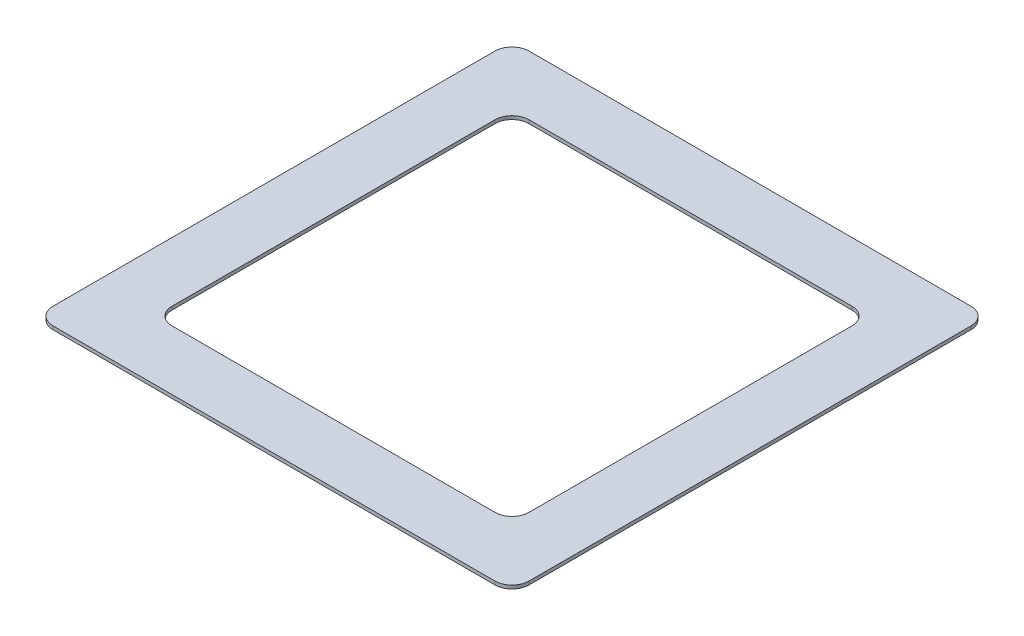
ISO-10303-21;
HEADER;
FILE_DESCRIPTION(('STEP AP214'),'2;1');
FILE_NAME('part.step','',(''),(''),'','','');
FILE_SCHEMA(('AUTOMOTIVE_DESIGN { 1 0 10303 214 1 1 1 1 }'));
ENDSEC;
DATA;
#1=APPLICATION_CONTEXT('core data for automotive mechanical design processes');
#2=APPLICATION_PROTOCOL_DEFINITION('international standard','automotive_design',2000,#1);
#3=PRODUCT_CONTEXT('',#1,'mechanical');
#4=PRODUCT('Part','Part','',(#3));
#5=PRODUCT_RELATED_PRODUCT_CATEGORY('part','',(#4));
#6=PRODUCT_DEFINITION_FORMATION('','',#4);
#7=PRODUCT_DEFINITION_CONTEXT('part definition',#1,'design');
#8=PRODUCT_DEFINITION('design','',#6,#7);
#9=PRODUCT_DEFINITION_SHAPE('','',#8);
#10=(LENGTH_UNIT() NAMED_UNIT(*) SI_UNIT(.MILLI.,.METRE.));
#11=(NAMED_UNIT(*) PLANE_ANGLE_UNIT() SI_UNIT($,.RADIAN.));
#12=(NAMED_UNIT(*) SI_UNIT($,.STERADIAN.) SOLID_ANGLE_UNIT());
#13=UNCERTAINTY_MEASURE_WITH_UNIT(LENGTH_MEASURE(1.E-05),#10,'distance_accuracy_value','');
#14=(GEOMETRIC_REPRESENTATION_CONTEXT(3) GLOBAL_UNCERTAINTY_ASSIGNED_CONTEXT((#13)) GLOBAL_UNIT_ASSIGNED_CONTEXT((#10,
#11,#12)) REPRESENTATION_CONTEXT('',''));
#15=CARTESIAN_POINT('',(0.,0.,0.));
#16=DIRECTION('',(0.,0.,1.));
#17=DIRECTION('',(1.,0.,0.));
#18=AXIS2_PLACEMENT_3D('',#15,#16,#17);
#19=CARTESIAN_POINT('',(10.,2.,270.));
#20=DIRECTION('',(0.,1.,0.));
#21=DIRECTION('',(0.,0.,1.));
#22=AXIS2_PLACEMENT_3D('',#19,#20,#21);
#23=PLANE('',#22);
#24=CARTESIAN_POINT('',(10.,2.,270.));
#25=DIRECTION('',(0.,1.,0.));
#26=DIRECTION('',(0.,0.,1.));
#27=AXIS2_PLACEMENT_3D('',#24,#25,#26);
#28=CIRCLE('',#27,10.);
#29=CARTESIAN_POINT('',(0.,2.,270.));
#30=VERTEX_POINT('',#29);
#31=CARTESIAN_POINT('',(10.0000000000001,2.,280.));
#32=VERTEX_POINT('',#31);
#33=EDGE_CURVE('E212',#30,#32,#28,.T.);
#34=ORIENTED_EDGE('',*,*,#33,.T.);
#35=DIRECTION('',(1.,0.,0.));
#36=VECTOR('',#35,1.);
#37=CARTESIAN_POINT('',(10.0000000000001,2.,280.));
#38=LINE('',#37,#36);
#39=CARTESIAN_POINT('',(270.,2.,280.));
#40=VERTEX_POINT('',#39);
#41=EDGE_CURVE('E215',#32,#40,#38,.T.);
#42=ORIENTED_EDGE('',*,*,#41,.T.);
#43=CARTESIAN_POINT('',(270.,2.,270.));
#44=DIRECTION('',(0.,1.,0.));
#45=DIRECTION('',(0.,0.,1.));
#46=AXIS2_PLACEMENT_3D('',#43,#44,#45);
#47=CIRCLE('',#46,10.);
#48=CARTESIAN_POINT('',(280.,2.,270.));
#49=VERTEX_POINT('',#48);
#50=EDGE_CURVE('E218',#40,#49,#47,.T.);
#51=ORIENTED_EDGE('',*,*,#50,.T.);
#52=DIRECTION('',(0.,0.,-1.));
#53=VECTOR('',#52,1.);
#54=CARTESIAN_POINT('',(280.,2.,10.0000000000001));
#55=LINE('',#54,#53);
#56=CARTESIAN_POINT('',(280.,2.,10.0000000000001));
#57=VERTEX_POINT('',#56);
#58=EDGE_CURVE('E220',#49,#57,#55,.T.);
#59=ORIENTED_EDGE('',*,*,#58,.T.);
#60=CARTESIAN_POINT('',(270.,2.,10.));
#61=DIRECTION('',(0.,1.,0.));
#62=DIRECTION('',(0.,0.,-1.));
#63=AXIS2_PLACEMENT_3D('',#60,#61,#62);
#64=CIRCLE('',#63,10.);
#65=CARTESIAN_POINT('',(270.,2.,0.));
#66=VERTEX_POINT('',#65);
#67=EDGE_CURVE('E222',#57,#66,#64,.T.);
#68=ORIENTED_EDGE('',*,*,#67,.T.);
#69=DIRECTION('',(-1.,0.,0.));
#70=VECTOR('',#69,1.);
#71=CARTESIAN_POINT('',(10.0000000000001,2.,0.));
#72=LINE('',#71,#70);
#73=CARTESIAN_POINT('',(10.0000000000001,2.,0.));
#74=VERTEX_POINT('',#73);
#75=EDGE_CURVE('E224',#66,#74,#72,.T.);
#76=ORIENTED_EDGE('',*,*,#75,.T.);
#77=CARTESIAN_POINT('',(10.,2.,10.));
#78=DIRECTION('',(0.,1.,0.));
#79=DIRECTION('',(0.,0.,1.));
#80=AXIS2_PLACEMENT_3D('',#77,#78,#79);
#81=CIRCLE('',#80,10.);
#82=CARTESIAN_POINT('',(0.,2.,10.0000000000001));
#83=VERTEX_POINT('',#82);
#84=EDGE_CURVE('E226',#74,#83,#81,.T.);
#85=ORIENTED_EDGE('',*,*,#84,.T.);
#86=DIRECTION('',(0.,0.,1.));
#87=VECTOR('',#86,1.);
#88=CARTESIAN_POINT('',(0.,2.,10.0000000000001));
#89=LINE('',#88,#87);
#90=EDGE_CURVE('E228',#83,#30,#89,.T.);
#91=ORIENTED_EDGE('',*,*,#90,.T.);
#92=EDGE_LOOP('',(#34,#42,#51,#59,#68,#76,#85,#91));
#93=FACE_BOUND('',#92,.T.);
#94=DIRECTION('',(1.,0.,0.));
#95=VECTOR('',#94,1.);
#96=CARTESIAN_POINT('',(45.0000000000001,2.,245.));
#97=LINE('',#96,#95);
#98=CARTESIAN_POINT('',(45.0000000000001,2.,245.));
#99=VERTEX_POINT('',#98);
#100=CARTESIAN_POINT('',(235.,2.,245.));
#101=VERTEX_POINT('',#100);
#102=EDGE_CURVE('E155',#99,#101,#97,.T.);
#103=ORIENTED_EDGE('',*,*,#102,.F.);
#104=CARTESIAN_POINT('',(45.,2.,235.));
#105=DIRECTION('',(0.,1.,0.));
#106=DIRECTION('',(0.,0.,1.));
#107=AXIS2_PLACEMENT_3D('',#104,#105,#106);
#108=CIRCLE('',#107,10.);
#109=CARTESIAN_POINT('',(35.,2.,235.));
#110=VERTEX_POINT('',#109);
#111=EDGE_CURVE('E147',#110,#99,#108,.T.);
#112=ORIENTED_EDGE('',*,*,#111,.F.);
#113=DIRECTION('',(0.,0.,1.));
#114=VECTOR('',#113,1.);
#115=CARTESIAN_POINT('',(35.,2.,45.0000000000001));
#116=LINE('',#115,#114);
#117=CARTESIAN_POINT('',(35.,2.,45.0000000000001));
#118=VERTEX_POINT('',#117);
#119=EDGE_CURVE('E180',#118,#110,#116,.T.);
#120=ORIENTED_EDGE('',*,*,#119,.F.);
#121=CARTESIAN_POINT('',(45.,2.,45.));
#122=DIRECTION('',(0.,1.,0.));
#123=DIRECTION('',(0.,0.,-1.));
#124=AXIS2_PLACEMENT_3D('',#121,#122,#123);
#125=CIRCLE('',#124,10.);
#126=CARTESIAN_POINT('',(45.,2.,35.));
#127=VERTEX_POINT('',#126);
#128=EDGE_CURVE('E178',#127,#118,#125,.T.);
#129=ORIENTED_EDGE('',*,*,#128,.F.);
#130=DIRECTION('',(-1.,0.,0.));
#131=VECTOR('',#130,1.);
#132=CARTESIAN_POINT('',(45.0000000000001,2.,35.));
#133=LINE('',#132,#131);
#134=CARTESIAN_POINT('',(235.,2.,35.));
#135=VERTEX_POINT('',#134);
#136=EDGE_CURVE('E176',#135,#127,#133,.T.);
#137=ORIENTED_EDGE('',*,*,#136,.F.);
#138=CARTESIAN_POINT('',(235.,2.,45.));
#139=DIRECTION('',(0.,1.,0.));
#140=DIRECTION('',(0.,0.,1.));
#141=AXIS2_PLACEMENT_3D('',#138,#139,#140);
#142=CIRCLE('',#141,10.);
#143=CARTESIAN_POINT('',(245.,2.,45.0000000000001));
#144=VERTEX_POINT('',#143);
#145=EDGE_CURVE('E174',#144,#135,#142,.T.);
#146=ORIENTED_EDGE('',*,*,#145,.F.);
#147=DIRECTION('',(0.,0.,-1.));
#148=VECTOR('',#147,1.);
#149=CARTESIAN_POINT('',(245.,2.,45.0000000000001));
#150=LINE('',#149,#148);
#151=CARTESIAN_POINT('',(245.,2.,235.));
#152=VERTEX_POINT('',#151);
#153=EDGE_CURVE('E170',#152,#144,#150,.T.);
#154=ORIENTED_EDGE('',*,*,#153,.F.);
#155=CARTESIAN_POINT('',(235.,2.,235.));
#156=DIRECTION('',(0.,1.,0.));
#157=DIRECTION('',(0.,0.,1.));
#158=AXIS2_PLACEMENT_3D('',#155,#156,#157);
#159=CIRCLE('',#158,10.);
#160=EDGE_CURVE('E168',#101,#152,#159,.T.);
#161=ORIENTED_EDGE('',*,*,#160,.F.);
#162=EDGE_LOOP('',(#103,#112,#120,#129,#137,#146,#154,#161));
#163=FACE_BOUND('',#162,.T.);
#164=ADVANCED_FACE('F34',(#93,#163),#23,.T.);
#165=CARTESIAN_POINT('',(10.,0.,270.));
#166=DIRECTION('',(0.,1.,0.));
#167=DIRECTION('',(0.,0.,1.));
#168=AXIS2_PLACEMENT_3D('',#165,#166,#167);
#169=PLANE('',#168);
#170=CARTESIAN_POINT('',(10.,0.,270.));
#171=DIRECTION('',(0.,1.,0.));
#172=DIRECTION('',(0.,0.,1.));
#173=AXIS2_PLACEMENT_3D('',#170,#171,#172);
#174=CIRCLE('',#173,10.);
#175=CARTESIAN_POINT('',(0.,0.,270.));
#176=VERTEX_POINT('',#175);
#177=CARTESIAN_POINT('',(10.0000000000001,0.,280.));
#178=VERTEX_POINT('',#177);
#179=EDGE_CURVE('E163',#176,#178,#174,.T.);
#180=ORIENTED_EDGE('',*,*,#179,.F.);
#181=DIRECTION('',(0.,0.,1.));
#182=VECTOR('',#181,1.);
#183=CARTESIAN_POINT('',(0.,0.,10.0000000000001));
#184=LINE('',#183,#182);
#185=CARTESIAN_POINT('',(0.,0.,10.0000000000001));
#186=VERTEX_POINT('',#185);
#187=EDGE_CURVE('E216',#186,#176,#184,.T.);
#188=ORIENTED_EDGE('',*,*,#187,.F.);
#189=CARTESIAN_POINT('',(10.,0.,10.));
#190=DIRECTION('',(0.,1.,0.));
#191=DIRECTION('',(0.,0.,1.));
#192=AXIS2_PLACEMENT_3D('',#189,#190,#191);
#193=CIRCLE('',#192,10.);
#194=CARTESIAN_POINT('',(10.0000000000001,0.,0.));
#195=VERTEX_POINT('',#194);
#196=EDGE_CURVE('E243',#195,#186,#193,.T.);
#197=ORIENTED_EDGE('',*,*,#196,.F.);
#198=DIRECTION('',(-1.,0.,0.));
#199=VECTOR('',#198,1.);
#200=CARTESIAN_POINT('',(10.0000000000001,0.,0.));
#201=LINE('',#200,#199);
#202=CARTESIAN_POINT('',(270.,0.,0.));
#203=VERTEX_POINT('',#202);
#204=EDGE_CURVE('E241',#203,#195,#201,.T.);
#205=ORIENTED_EDGE('',*,*,#204,.F.);
#206=CARTESIAN_POINT('',(270.,0.,10.));
#207=DIRECTION('',(0.,1.,0.));
#208=DIRECTION('',(0.,0.,-1.));
#209=AXIS2_PLACEMENT_3D('',#206,#207,#208);
#210=CIRCLE('',#209,10.);
#211=CARTESIAN_POINT('',(280.,0.,10.0000000000001));
#212=VERTEX_POINT('',#211);
#213=EDGE_CURVE('E239',#212,#203,#210,.T.);
#214=ORIENTED_EDGE('',*,*,#213,.F.);
#215=DIRECTION('',(0.,0.,-1.));
#216=VECTOR('',#215,1.);
#217=CARTESIAN_POINT('',(280.,0.,10.0000000000001));
#218=LINE('',#217,#216);
#219=CARTESIAN_POINT('',(280.,0.,270.));
#220=VERTEX_POINT('',#219);
#221=EDGE_CURVE('E237',#220,#212,#218,.T.);
#222=ORIENTED_EDGE('',*,*,#221,.F.);
#223=CARTESIAN_POINT('',(270.,0.,270.));
#224=DIRECTION('',(0.,1.,0.));
#225=DIRECTION('',(0.,0.,1.));
#226=AXIS2_PLACEMENT_3D('',#223,#224,#225);
#227=CIRCLE('',#226,10.);
#228=CARTESIAN_POINT('',(270.,0.,280.));
#229=VERTEX_POINT('',#228);
#230=EDGE_CURVE('E235',#229,#220,#227,.T.);
#231=ORIENTED_EDGE('',*,*,#230,.F.);
#232=DIRECTION('',(1.,0.,0.));
#233=VECTOR('',#232,1.);
#234=CARTESIAN_POINT('',(10.0000000000001,0.,280.));
#235=LINE('',#234,#233);
#236=EDGE_CURVE('E233',#178,#229,#235,.T.);
#237=ORIENTED_EDGE('',*,*,#236,.F.);
#238=EDGE_LOOP('',(#180,#188,#197,#205,#214,#222,#231,#237));
#239=FACE_BOUND('',#238,.T.);
#240=CARTESIAN_POINT('',(45.,0.,235.));
#241=DIRECTION('',(0.,1.,0.));
#242=DIRECTION('',(0.,0.,1.));
#243=AXIS2_PLACEMENT_3D('',#240,#241,#242);
#244=CIRCLE('',#243,10.);
#245=CARTESIAN_POINT('',(35.,0.,235.));
#246=VERTEX_POINT('',#245);
#247=CARTESIAN_POINT('',(45.0000000000001,0.,245.));
#248=VERTEX_POINT('',#247);
#249=EDGE_CURVE('E57',#246,#248,#244,.T.);
#250=ORIENTED_EDGE('',*,*,#249,.T.);
#251=DIRECTION('',(1.,0.,0.));
#252=VECTOR('',#251,1.);
#253=CARTESIAN_POINT('',(45.0000000000001,0.,245.));
#254=LINE('',#253,#252);
#255=CARTESIAN_POINT('',(235.,0.,245.));
#256=VERTEX_POINT('',#255);
#257=EDGE_CURVE('E162',#248,#256,#254,.T.);
#258=ORIENTED_EDGE('',*,*,#257,.T.);
#259=CARTESIAN_POINT('',(235.,0.,235.));
#260=DIRECTION('',(0.,1.,0.));
#261=DIRECTION('',(0.,0.,1.));
#262=AXIS2_PLACEMENT_3D('',#259,#260,#261);
#263=CIRCLE('',#262,10.);
#264=CARTESIAN_POINT('',(245.,0.,235.));
#265=VERTEX_POINT('',#264);
#266=EDGE_CURVE('E184',#256,#265,#263,.T.);
#267=ORIENTED_EDGE('',*,*,#266,.T.);
#268=DIRECTION('',(0.,0.,-1.));
#269=VECTOR('',#268,1.);
#270=CARTESIAN_POINT('',(245.,0.,45.0000000000001));
#271=LINE('',#270,#269);
#272=CARTESIAN_POINT('',(245.,0.,45.0000000000001));
#273=VERTEX_POINT('',#272);
#274=EDGE_CURVE('E187',#265,#273,#271,.T.);
#275=ORIENTED_EDGE('',*,*,#274,.T.);
#276=CARTESIAN_POINT('',(235.,0.,45.));
#277=DIRECTION('',(0.,1.,0.));
#278=DIRECTION('',(0.,0.,1.));
#279=AXIS2_PLACEMENT_3D('',#276,#277,#278);
#280=CIRCLE('',#279,10.);
#281=CARTESIAN_POINT('',(235.,0.,35.));
#282=VERTEX_POINT('',#281);
#283=EDGE_CURVE('E190',#273,#282,#280,.T.);
#284=ORIENTED_EDGE('',*,*,#283,.T.);
#285=DIRECTION('',(-1.,0.,0.));
#286=VECTOR('',#285,1.);
#287=CARTESIAN_POINT('',(45.0000000000001,0.,35.));
#288=LINE('',#287,#286);
#289=CARTESIAN_POINT('',(45.,0.,35.));
#290=VERTEX_POINT('',#289);
#291=EDGE_CURVE('E193',#282,#290,#288,.T.);
#292=ORIENTED_EDGE('',*,*,#291,.T.);
#293=CARTESIAN_POINT('',(45.,0.,45.));
#294=DIRECTION('',(0.,1.,0.));
#295=DIRECTION('',(0.,0.,-1.));
#296=AXIS2_PLACEMENT_3D('',#293,#294,#295);
#297=CIRCLE('',#296,10.);
#298=CARTESIAN_POINT('',(35.,0.,45.0000000000001));
#299=VERTEX_POINT('',#298);
#300=EDGE_CURVE('E196',#290,#299,#297,.T.);
#301=ORIENTED_EDGE('',*,*,#300,.T.);
#302=DIRECTION('',(0.,0.,1.));
#303=VECTOR('',#302,1.);
#304=CARTESIAN_POINT('',(35.,0.,45.0000000000001));
#305=LINE('',#304,#303);
#306=EDGE_CURVE('E156',#299,#246,#305,.T.);
#307=ORIENTED_EDGE('',*,*,#306,.T.);
#308=EDGE_LOOP('',(#250,#258,#267,#275,#284,#292,#301,#307));
#309=FACE_BOUND('',#308,.T.);
#310=ADVANCED_FACE('F273',(#239,#309),#169,.F.);
#311=CARTESIAN_POINT('',(10.,2.,270.));
#312=DIRECTION('',(0.,-1.,0.));
#313=DIRECTION('',(0.,0.,-1.));
#314=AXIS2_PLACEMENT_3D('',#311,#312,#313);
#315=CYLINDRICAL_SURFACE('',#314,10.);
#316=ORIENTED_EDGE('',*,*,#179,.T.);
#317=DIRECTION('',(0.,-1.,0.));
#318=VECTOR('',#317,1.);
#319=CARTESIAN_POINT('',(10.0000000000001,2.,280.));
#320=LINE('',#319,#318);
#321=EDGE_CURVE('E11',#32,#178,#320,.T.);
#322=ORIENTED_EDGE('',*,*,#321,.F.);
#323=ORIENTED_EDGE('',*,*,#33,.F.);
#324=DIRECTION('',(0.,-1.,0.));
#325=VECTOR('',#324,1.);
#326=CARTESIAN_POINT('',(0.,2.,270.));
#327=LINE('',#326,#325);
#328=EDGE_CURVE('E230',#30,#176,#327,.T.);
#329=ORIENTED_EDGE('',*,*,#328,.T.);
#330=EDGE_LOOP('',(#316,#322,#323,#329));
#331=FACE_BOUND('',#330,.T.);
#332=ADVANCED_FACE('F36',(#331),#315,.T.);
#333=CARTESIAN_POINT('',(10.0000000000001,2.,280.));
#334=DIRECTION('',(0.,0.,-1.));
#335=DIRECTION('',(-1.,0.,0.));
#336=AXIS2_PLACEMENT_3D('',#333,#334,#335);
#337=PLANE('',#336);
#338=ORIENTED_EDGE('',*,*,#236,.T.);
#339=DIRECTION('',(0.,-1.,0.));
#340=VECTOR('',#339,1.);
#341=CARTESIAN_POINT('',(270.,2.,280.));
#342=LINE('',#341,#340);
#343=EDGE_CURVE('E42',#40,#229,#342,.T.);
#344=ORIENTED_EDGE('',*,*,#343,.F.);
#345=ORIENTED_EDGE('',*,*,#41,.F.);
#346=ORIENTED_EDGE('',*,*,#321,.T.);
#347=EDGE_LOOP('',(#338,#344,#345,#346));
#348=FACE_BOUND('',#347,.T.);
#349=ADVANCED_FACE('F290',(#348),#337,.F.);
#350=CARTESIAN_POINT('',(270.,2.,270.));
#351=DIRECTION('',(0.,-1.,0.));
#352=DIRECTION('',(0.,0.,-1.));
#353=AXIS2_PLACEMENT_3D('',#350,#351,#352);
#354=CYLINDRICAL_SURFACE('',#353,10.);
#355=ORIENTED_EDGE('',*,*,#230,.T.);
#356=DIRECTION('',(0.,-1.,0.));
#357=VECTOR('',#356,1.);
#358=CARTESIAN_POINT('',(280.,2.,270.));
#359=LINE('',#358,#357);
#360=EDGE_CURVE('E260',#49,#220,#359,.T.);
#361=ORIENTED_EDGE('',*,*,#360,.F.);
#362=ORIENTED_EDGE('',*,*,#50,.F.);
#363=ORIENTED_EDGE('',*,*,#343,.T.);
#364=EDGE_LOOP('',(#355,#361,#362,#363));
#365=FACE_BOUND('',#364,.T.);
#366=ADVANCED_FACE('F267',(#365),#354,.T.);
#367=CARTESIAN_POINT('',(280.,2.,10.0000000000001));
#368=DIRECTION('',(-1.,0.,0.));
#369=DIRECTION('',(0.,0.,1.));
#370=AXIS2_PLACEMENT_3D('',#367,#368,#369);
#371=PLANE('',#370);
#372=ORIENTED_EDGE('',*,*,#221,.T.);
#373=DIRECTION('',(0.,-1.,0.));
#374=VECTOR('',#373,1.);
#375=CARTESIAN_POINT('',(280.,2.,10.0000000000001));
#376=LINE('',#375,#374);
#377=EDGE_CURVE('E257',#57,#212,#376,.T.);
#378=ORIENTED_EDGE('',*,*,#377,.F.);
#379=ORIENTED_EDGE('',*,*,#58,.F.);
#380=ORIENTED_EDGE('',*,*,#360,.T.);
#381=EDGE_LOOP('',(#372,#378,#379,#380));
#382=FACE_BOUND('',#381,.T.);
#383=ADVANCED_FACE('F279',(#382),#371,.F.);
#384=CARTESIAN_POINT('',(270.,2.,10.));
#385=DIRECTION('',(0.,-1.,0.));
#386=DIRECTION('',(0.,0.,-1.));
#387=AXIS2_PLACEMENT_3D('',#384,#385,#386);
#388=CYLINDRICAL_SURFACE('',#387,10.);
#389=ORIENTED_EDGE('',*,*,#213,.T.);
#390=DIRECTION('',(0.,-1.,0.));
#391=VECTOR('',#390,1.);
#392=CARTESIAN_POINT('',(270.,2.,0.));
#393=LINE('',#392,#391);
#394=EDGE_CURVE('E254',#66,#203,#393,.T.);
#395=ORIENTED_EDGE('',*,*,#394,.F.);
#396=ORIENTED_EDGE('',*,*,#67,.F.);
#397=ORIENTED_EDGE('',*,*,#377,.T.);
#398=EDGE_LOOP('',(#389,#395,#396,#397));
#399=FACE_BOUND('',#398,.T.);
#400=ADVANCED_FACE('F283',(#399),#388,.T.);
#401=CARTESIAN_POINT('',(10.0000000000001,2.,0.));
#402=DIRECTION('',(0.,0.,1.));
#403=DIRECTION('',(1.,0.,0.));
#404=AXIS2_PLACEMENT_3D('',#401,#402,#403);
#405=PLANE('',#404);
#406=ORIENTED_EDGE('',*,*,#204,.T.);
#407=DIRECTION('',(0.,-1.,0.));
#408=VECTOR('',#407,1.);
#409=CARTESIAN_POINT('',(10.0000000000001,2.,0.));
#410=LINE('',#409,#408);
#411=EDGE_CURVE('E251',#74,#195,#410,.T.);
#412=ORIENTED_EDGE('',*,*,#411,.F.);
#413=ORIENTED_EDGE('',*,*,#75,.F.);
#414=ORIENTED_EDGE('',*,*,#394,.T.);
#415=EDGE_LOOP('',(#406,#412,#413,#414));
#416=FACE_BOUND('',#415,.T.);
#417=ADVANCED_FACE('F303',(#416),#405,.F.);
#418=CARTESIAN_POINT('',(10.,2.,10.));
#419=DIRECTION('',(0.,-1.,0.));
#420=DIRECTION('',(0.,0.,-1.));
#421=AXIS2_PLACEMENT_3D('',#418,#419,#420);
#422=CYLINDRICAL_SURFACE('',#421,10.);
#423=ORIENTED_EDGE('',*,*,#196,.T.);
#424=DIRECTION('',(0.,-1.,0.));
#425=VECTOR('',#424,1.);
#426=CARTESIAN_POINT('',(0.,2.,10.0000000000001));
#427=LINE('',#426,#425);
#428=EDGE_CURVE('E248',#83,#186,#427,.T.);
#429=ORIENTED_EDGE('',*,*,#428,.F.);
#430=ORIENTED_EDGE('',*,*,#84,.F.);
#431=ORIENTED_EDGE('',*,*,#411,.T.);
#432=EDGE_LOOP('',(#423,#429,#430,#431));
#433=FACE_BOUND('',#432,.T.);
#434=ADVANCED_FACE('F301',(#433),#422,.T.);
#435=CARTESIAN_POINT('',(0.,2.,10.0000000000001));
#436=DIRECTION('',(1.,0.,0.));
#437=DIRECTION('',(0.,0.,-1.));
#438=AXIS2_PLACEMENT_3D('',#435,#436,#437);
#439=PLANE('',#438);
#440=ORIENTED_EDGE('',*,*,#187,.T.);
#441=ORIENTED_EDGE('',*,*,#328,.F.);
#442=ORIENTED_EDGE('',*,*,#90,.F.);
#443=ORIENTED_EDGE('',*,*,#428,.T.);
#444=EDGE_LOOP('',(#440,#441,#442,#443));
#445=FACE_BOUND('',#444,.T.);
#446=ADVANCED_FACE('F296',(#445),#439,.F.);
#447=CARTESIAN_POINT('',(45.,2.,235.));
#448=DIRECTION('',(0.,-1.,0.));
#449=DIRECTION('',(0.,0.,-1.));
#450=AXIS2_PLACEMENT_3D('',#447,#448,#449);
#451=CYLINDRICAL_SURFACE('',#450,10.);
#452=ORIENTED_EDGE('',*,*,#249,.F.);
#453=DIRECTION('',(0.,-1.,0.));
#454=VECTOR('',#453,1.);
#455=CARTESIAN_POINT('',(35.,2.,235.));
#456=LINE('',#455,#454);
#457=EDGE_CURVE('E151',#110,#246,#456,.T.);
#458=ORIENTED_EDGE('',*,*,#457,.F.);
#459=ORIENTED_EDGE('',*,*,#111,.T.);
#460=DIRECTION('',(0.,-1.,0.));
#461=VECTOR('',#460,1.);
#462=CARTESIAN_POINT('',(45.0000000000001,2.,245.));
#463=LINE('',#462,#461);
#464=EDGE_CURVE('E150',#99,#248,#463,.T.);
#465=ORIENTED_EDGE('',*,*,#464,.T.);
#466=EDGE_LOOP('',(#452,#458,#459,#465));
#467=FACE_BOUND('',#466,.T.);
#468=ADVANCED_FACE('F149',(#467),#451,.F.);
#469=CARTESIAN_POINT('',(45.0000000000001,2.,245.));
#470=DIRECTION('',(0.,0.,-1.));
#471=DIRECTION('',(-1.,0.,0.));
#472=AXIS2_PLACEMENT_3D('',#469,#470,#471);
#473=PLANE('',#472);
#474=ORIENTED_EDGE('',*,*,#257,.F.);
#475=ORIENTED_EDGE('',*,*,#464,.F.);
#476=ORIENTED_EDGE('',*,*,#102,.T.);
#477=DIRECTION('',(0.,-1.,0.));
#478=VECTOR('',#477,1.);
#479=CARTESIAN_POINT('',(235.,2.,245.));
#480=LINE('',#479,#478);
#481=EDGE_CURVE('E164',#101,#256,#480,.T.);
#482=ORIENTED_EDGE('',*,*,#481,.T.);
#483=EDGE_LOOP('',(#474,#475,#476,#482));
#484=FACE_BOUND('',#483,.T.);
#485=ADVANCED_FACE('F159',(#484),#473,.T.);
#486=CARTESIAN_POINT('',(235.,2.,235.));
#487=DIRECTION('',(0.,-1.,0.));
#488=DIRECTION('',(0.,0.,-1.));
#489=AXIS2_PLACEMENT_3D('',#486,#487,#488);
#490=CYLINDRICAL_SURFACE('',#489,10.);
#491=ORIENTED_EDGE('',*,*,#266,.F.);
#492=ORIENTED_EDGE('',*,*,#481,.F.);
#493=ORIENTED_EDGE('',*,*,#160,.T.);
#494=DIRECTION('',(0.,-1.,0.));
#495=VECTOR('',#494,1.);
#496=CARTESIAN_POINT('',(245.,2.,235.));
#497=LINE('',#496,#495);
#498=EDGE_CURVE('E209',#152,#265,#497,.T.);
#499=ORIENTED_EDGE('',*,*,#498,.T.);
#500=EDGE_LOOP('',(#491,#492,#493,#499));
#501=FACE_BOUND('',#500,.T.);
#502=ADVANCED_FACE('F328',(#501),#490,.F.);
#503=CARTESIAN_POINT('',(245.,2.,45.0000000000001));
#504=DIRECTION('',(-1.,0.,0.));
#505=DIRECTION('',(0.,0.,1.));
#506=AXIS2_PLACEMENT_3D('',#503,#504,#505);
#507=PLANE('',#506);
#508=ORIENTED_EDGE('',*,*,#274,.F.);
#509=ORIENTED_EDGE('',*,*,#498,.F.);
#510=ORIENTED_EDGE('',*,*,#153,.T.);
#511=DIRECTION('',(0.,-1.,0.));
#512=VECTOR('',#511,1.);
#513=CARTESIAN_POINT('',(245.,2.,45.0000000000001));
#514=LINE('',#513,#512);
#515=EDGE_CURVE('E207',#144,#273,#514,.T.);
#516=ORIENTED_EDGE('',*,*,#515,.T.);
#517=EDGE_LOOP('',(#508,#509,#510,#516));
#518=FACE_BOUND('',#517,.T.);
#519=ADVANCED_FACE('F332',(#518),#507,.T.);
#520=CARTESIAN_POINT('',(235.,2.,45.));
#521=DIRECTION('',(0.,-1.,0.));
#522=DIRECTION('',(0.,0.,-1.));
#523=AXIS2_PLACEMENT_3D('',#520,#521,#522);
#524=CYLINDRICAL_SURFACE('',#523,10.);
#525=ORIENTED_EDGE('',*,*,#283,.F.);
#526=ORIENTED_EDGE('',*,*,#515,.F.);
#527=ORIENTED_EDGE('',*,*,#145,.T.);
#528=DIRECTION('',(0.,-1.,0.));
#529=VECTOR('',#528,1.);
#530=CARTESIAN_POINT('',(235.,2.,35.));
#531=LINE('',#530,#529);
#532=EDGE_CURVE('E205',#135,#282,#531,.T.);
#533=ORIENTED_EDGE('',*,*,#532,.T.);
#534=EDGE_LOOP('',(#525,#526,#527,#533));
#535=FACE_BOUND('',#534,.T.);
#536=ADVANCED_FACE('F338',(#535),#524,.F.);
#537=CARTESIAN_POINT('',(45.0000000000001,2.,35.));
#538=DIRECTION('',(0.,0.,1.));
#539=DIRECTION('',(1.,0.,0.));
#540=AXIS2_PLACEMENT_3D('',#537,#538,#539);
#541=PLANE('',#540);
#542=ORIENTED_EDGE('',*,*,#291,.F.);
#543=ORIENTED_EDGE('',*,*,#532,.F.);
#544=ORIENTED_EDGE('',*,*,#136,.T.);
#545=DIRECTION('',(0.,-1.,0.));
#546=VECTOR('',#545,1.);
#547=CARTESIAN_POINT('',(45.,2.,35.));
#548=LINE('',#547,#546);
#549=EDGE_CURVE('E203',#127,#290,#548,.T.);
#550=ORIENTED_EDGE('',*,*,#549,.T.);
#551=EDGE_LOOP('',(#542,#543,#544,#550));
#552=FACE_BOUND('',#551,.T.);
#553=ADVANCED_FACE('F342',(#552),#541,.T.);
#554=CARTESIAN_POINT('',(45.,2.,45.));
#555=DIRECTION('',(0.,-1.,0.));
#556=DIRECTION('',(0.,0.,-1.));
#557=AXIS2_PLACEMENT_3D('',#554,#555,#556);
#558=CYLINDRICAL_SURFACE('',#557,10.);
#559=ORIENTED_EDGE('',*,*,#300,.F.);
#560=ORIENTED_EDGE('',*,*,#549,.F.);
#561=ORIENTED_EDGE('',*,*,#128,.T.);
#562=DIRECTION('',(0.,-1.,0.));
#563=VECTOR('',#562,1.);
#564=CARTESIAN_POINT('',(35.,2.,45.0000000000001));
#565=LINE('',#564,#563);
#566=EDGE_CURVE('E49',#118,#299,#565,.T.);
#567=ORIENTED_EDGE('',*,*,#566,.T.);
#568=EDGE_LOOP('',(#559,#560,#561,#567));
#569=FACE_BOUND('',#568,.T.);
#570=ADVANCED_FACE('F346',(#569),#558,.F.);
#571=CARTESIAN_POINT('',(35.,2.,45.0000000000001));
#572=DIRECTION('',(1.,0.,0.));
#573=DIRECTION('',(0.,0.,-1.));
#574=AXIS2_PLACEMENT_3D('',#571,#572,#573);
#575=PLANE('',#574);
#576=ORIENTED_EDGE('',*,*,#306,.F.);
#577=ORIENTED_EDGE('',*,*,#566,.F.);
#578=ORIENTED_EDGE('',*,*,#119,.T.);
#579=ORIENTED_EDGE('',*,*,#457,.T.);
#580=EDGE_LOOP('',(#576,#577,#578,#579));
#581=FACE_BOUND('',#580,.T.);
#582=ADVANCED_FACE('F350',(#581),#575,.T.);
#583=CLOSED_SHELL('',(#164,#310,#332,#349,#366,#383,#400,#417,#434,#446,#468,#485,#502,#519,
#536,#553,#570,#582));
#584=MANIFOLD_SOLID_BREP('B2',#583);
#585=ADVANCED_BREP_SHAPE_REPRESENTATION('',(#18,#584),#14);
#586=SHAPE_DEFINITION_REPRESENTATION(#9,#585);
ENDSEC;
END-ISO-10303-21;
